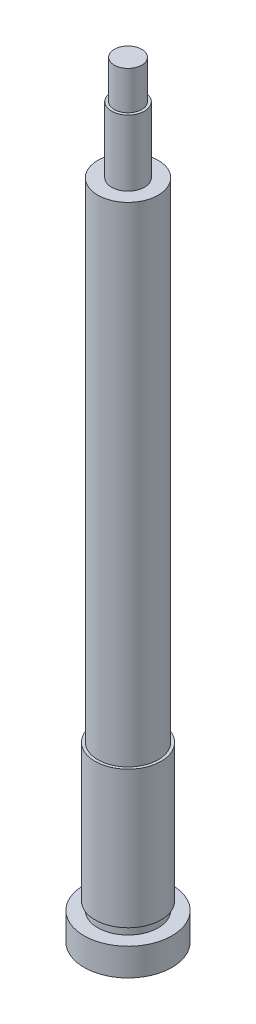
ISO-10303-21;
HEADER;
FILE_DESCRIPTION(('STEP AP214'),'2;1');
FILE_NAME('part.step','',(''),(''),'','','');
FILE_SCHEMA(('AUTOMOTIVE_DESIGN { 1 0 10303 214 1 1 1 1 }'));
ENDSEC;
DATA;
#1=APPLICATION_CONTEXT('core data for automotive mechanical design processes');
#2=APPLICATION_PROTOCOL_DEFINITION('international standard','automotive_design',2000,#1);
#3=PRODUCT_CONTEXT('',#1,'mechanical');
#4=PRODUCT('Part','Part','',(#3));
#5=PRODUCT_RELATED_PRODUCT_CATEGORY('part','',(#4));
#6=PRODUCT_DEFINITION_FORMATION('','',#4);
#7=PRODUCT_DEFINITION_CONTEXT('part definition',#1,'design');
#8=PRODUCT_DEFINITION('design','',#6,#7);
#9=PRODUCT_DEFINITION_SHAPE('','',#8);
#10=(LENGTH_UNIT() NAMED_UNIT(*) SI_UNIT(.MILLI.,.METRE.));
#11=(NAMED_UNIT(*) PLANE_ANGLE_UNIT() SI_UNIT($,.RADIAN.));
#12=(NAMED_UNIT(*) SI_UNIT($,.STERADIAN.) SOLID_ANGLE_UNIT());
#13=UNCERTAINTY_MEASURE_WITH_UNIT(LENGTH_MEASURE(1.E-05),#10,'distance_accuracy_value','');
#14=(GEOMETRIC_REPRESENTATION_CONTEXT(3) GLOBAL_UNCERTAINTY_ASSIGNED_CONTEXT((#13)) GLOBAL_UNIT_ASSIGNED_CONTEXT((#10,
#11,#12)) REPRESENTATION_CONTEXT('',''));
#15=CARTESIAN_POINT('',(0.,0.,0.));
#16=DIRECTION('',(0.,0.,1.));
#17=DIRECTION('',(1.,0.,0.));
#18=AXIS2_PLACEMENT_3D('',#15,#16,#17);
#19=CARTESIAN_POINT('',(0.,0.,0.));
#20=DIRECTION('',(0.,1.,0.));
#21=DIRECTION('',(0.,0.,1.));
#22=AXIS2_PLACEMENT_3D('',#19,#20,#21);
#23=PLANE('',#22);
#24=CARTESIAN_POINT('',(0.,0.,0.));
#25=DIRECTION('',(0.,-1.,0.));
#26=DIRECTION('',(0.,0.,-1.));
#27=AXIS2_PLACEMENT_3D('',#24,#25,#26);
#28=CIRCLE('',#27,16.);
#29=CARTESIAN_POINT('',(0.,0.,-16.));
#30=VERTEX_POINT('',#29);
#31=EDGE_CURVE('E10',#30,#30,#28,.T.);
#32=ORIENTED_EDGE('',*,*,#31,.T.);
#33=EDGE_LOOP('',(#32));
#34=FACE_BOUND('',#33,.T.);
#35=ADVANCED_FACE('F33',(#34),#23,.F.);
#36=CARTESIAN_POINT('',(0.,0.,0.));
#37=DIRECTION('',(0.,-1.,0.));
#38=DIRECTION('',(0.,0.,-1.));
#39=AXIS2_PLACEMENT_3D('',#36,#37,#38);
#40=CYLINDRICAL_SURFACE('',#39,16.);
#41=ORIENTED_EDGE('',*,*,#31,.F.);
#42=EDGE_LOOP('',(#41));
#43=FACE_BOUND('',#42,.T.);
#44=CARTESIAN_POINT('',(0.,10.,0.));
#45=DIRECTION('',(0.,-1.,0.));
#46=DIRECTION('',(0.,0.,-1.));
#47=AXIS2_PLACEMENT_3D('',#44,#45,#46);
#48=CIRCLE('',#47,16.);
#49=CARTESIAN_POINT('',(0.,10.,-16.));
#50=VERTEX_POINT('',#49);
#51=EDGE_CURVE('E39',#50,#50,#48,.T.);
#52=ORIENTED_EDGE('',*,*,#51,.T.);
#53=EDGE_LOOP('',(#52));
#54=FACE_BOUND('',#53,.T.);
#55=ADVANCED_FACE('F89',(#43,#54),#40,.T.);
#56=CARTESIAN_POINT('',(-11.,10.,0.));
#57=DIRECTION('',(0.,-1.,0.));
#58=DIRECTION('',(0.,0.,-1.));
#59=AXIS2_PLACEMENT_3D('',#56,#57,#58);
#60=PLANE('',#59);
#61=ORIENTED_EDGE('',*,*,#51,.F.);
#62=EDGE_LOOP('',(#61));
#63=FACE_BOUND('',#62,.T.);
#64=CARTESIAN_POINT('',(0.,10.,0.));
#65=DIRECTION('',(0.,-1.,0.));
#66=DIRECTION('',(0.,0.,-1.));
#67=AXIS2_PLACEMENT_3D('',#64,#65,#66);
#68=CIRCLE('',#67,11.);
#69=CARTESIAN_POINT('',(0.,10.,-11.));
#70=VERTEX_POINT('',#69);
#71=EDGE_CURVE('E43',#70,#70,#68,.T.);
#72=ORIENTED_EDGE('',*,*,#71,.T.);
#73=EDGE_LOOP('',(#72));
#74=FACE_BOUND('',#73,.T.);
#75=ADVANCED_FACE('F93',(#63,#74),#60,.F.);
#76=CARTESIAN_POINT('',(0.,0.,0.));
#77=DIRECTION('',(0.,-1.,0.));
#78=DIRECTION('',(0.,0.,-1.));
#79=AXIS2_PLACEMENT_3D('',#76,#77,#78);
#80=CYLINDRICAL_SURFACE('',#79,11.);
#81=ORIENTED_EDGE('',*,*,#71,.F.);
#82=EDGE_LOOP('',(#81));
#83=FACE_BOUND('',#82,.T.);
#84=CARTESIAN_POINT('',(0.,13.,0.));
#85=DIRECTION('',(0.,-1.,0.));
#86=DIRECTION('',(0.,0.,-1.));
#87=AXIS2_PLACEMENT_3D('',#84,#85,#86);
#88=CIRCLE('',#87,11.);
#89=CARTESIAN_POINT('',(0.,13.,-11.));
#90=VERTEX_POINT('',#89);
#91=EDGE_CURVE('E47',#90,#90,#88,.T.);
#92=ORIENTED_EDGE('',*,*,#91,.T.);
#93=EDGE_LOOP('',(#92));
#94=FACE_BOUND('',#93,.T.);
#95=ADVANCED_FACE('F98',(#83,#94),#80,.T.);
#96=CARTESIAN_POINT('',(-11.,13.,0.));
#97=DIRECTION('',(0.,1.,0.));
#98=DIRECTION('',(0.,0.,1.));
#99=AXIS2_PLACEMENT_3D('',#96,#97,#98);
#100=PLANE('',#99);
#101=ORIENTED_EDGE('',*,*,#91,.F.);
#102=EDGE_LOOP('',(#101));
#103=FACE_BOUND('',#102,.T.);
#104=CARTESIAN_POINT('',(0.,13.,0.));
#105=DIRECTION('',(0.,-1.,0.));
#106=DIRECTION('',(0.,0.,-1.));
#107=AXIS2_PLACEMENT_3D('',#104,#105,#106);
#108=CIRCLE('',#107,12.);
#109=CARTESIAN_POINT('',(0.,13.,-12.));
#110=VERTEX_POINT('',#109);
#111=EDGE_CURVE('E52',#110,#110,#108,.T.);
#112=ORIENTED_EDGE('',*,*,#111,.T.);
#113=EDGE_LOOP('',(#112));
#114=FACE_BOUND('',#113,.T.);
#115=ADVANCED_FACE('F104',(#103,#114),#100,.F.);
#116=CARTESIAN_POINT('',(0.,0.,0.));
#117=DIRECTION('',(0.,-1.,0.));
#118=DIRECTION('',(0.,0.,-1.));
#119=AXIS2_PLACEMENT_3D('',#116,#117,#118);
#120=CYLINDRICAL_SURFACE('',#119,12.);
#121=ORIENTED_EDGE('',*,*,#111,.F.);
#122=EDGE_LOOP('',(#121));
#123=FACE_BOUND('',#122,.T.);
#124=CARTESIAN_POINT('',(0.,63.,0.));
#125=DIRECTION('',(0.,-1.,0.));
#126=DIRECTION('',(0.,0.,-1.));
#127=AXIS2_PLACEMENT_3D('',#124,#125,#126);
#128=CIRCLE('',#127,12.);
#129=CARTESIAN_POINT('',(0.,63.,-12.));
#130=VERTEX_POINT('',#129);
#131=EDGE_CURVE('E55',#130,#130,#128,.T.);
#132=ORIENTED_EDGE('',*,*,#131,.T.);
#133=EDGE_LOOP('',(#132));
#134=FACE_BOUND('',#133,.T.);
#135=ADVANCED_FACE('F108',(#123,#134),#120,.T.);
#136=CARTESIAN_POINT('',(-11.,63.,0.));
#137=DIRECTION('',(0.,-1.,0.));
#138=DIRECTION('',(0.,0.,-1.));
#139=AXIS2_PLACEMENT_3D('',#136,#137,#138);
#140=PLANE('',#139);
#141=ORIENTED_EDGE('',*,*,#131,.F.);
#142=EDGE_LOOP('',(#141));
#143=FACE_BOUND('',#142,.T.);
#144=CARTESIAN_POINT('',(0.,63.,0.));
#145=DIRECTION('',(0.,-1.,0.));
#146=DIRECTION('',(0.,0.,-1.));
#147=AXIS2_PLACEMENT_3D('',#144,#145,#146);
#148=CIRCLE('',#147,11.);
#149=CARTESIAN_POINT('',(0.,63.,-11.));
#150=VERTEX_POINT('',#149);
#151=EDGE_CURVE('E58',#150,#150,#148,.T.);
#152=ORIENTED_EDGE('',*,*,#151,.T.);
#153=EDGE_LOOP('',(#152));
#154=FACE_BOUND('',#153,.T.);
#155=ADVANCED_FACE('F112',(#143,#154),#140,.F.);
#156=CARTESIAN_POINT('',(0.,0.,0.));
#157=DIRECTION('',(0.,-1.,0.));
#158=DIRECTION('',(0.,0.,-1.));
#159=AXIS2_PLACEMENT_3D('',#156,#157,#158);
#160=CYLINDRICAL_SURFACE('',#159,11.);
#161=ORIENTED_EDGE('',*,*,#151,.F.);
#162=EDGE_LOOP('',(#161));
#163=FACE_BOUND('',#162,.T.);
#164=CARTESIAN_POINT('',(0.,241.,0.));
#165=DIRECTION('',(0.,-1.,0.));
#166=DIRECTION('',(0.,0.,-1.));
#167=AXIS2_PLACEMENT_3D('',#164,#165,#166);
#168=CIRCLE('',#167,11.);
#169=CARTESIAN_POINT('',(0.,241.,-11.));
#170=VERTEX_POINT('',#169);
#171=EDGE_CURVE('E61',#170,#170,#168,.T.);
#172=ORIENTED_EDGE('',*,*,#171,.T.);
#173=EDGE_LOOP('',(#172));
#174=FACE_BOUND('',#173,.T.);
#175=ADVANCED_FACE('F116',(#163,#174),#160,.T.);
#176=CARTESIAN_POINT('',(-6.,241.,0.));
#177=DIRECTION('',(0.,-1.,0.));
#178=DIRECTION('',(0.,0.,-1.));
#179=AXIS2_PLACEMENT_3D('',#176,#177,#178);
#180=PLANE('',#179);
#181=ORIENTED_EDGE('',*,*,#171,.F.);
#182=EDGE_LOOP('',(#181));
#183=FACE_BOUND('',#182,.T.);
#184=CARTESIAN_POINT('',(0.,241.,0.));
#185=DIRECTION('',(0.,-1.,0.));
#186=DIRECTION('',(0.,0.,-1.));
#187=AXIS2_PLACEMENT_3D('',#184,#185,#186);
#188=CIRCLE('',#187,6.);
#189=CARTESIAN_POINT('',(0.,241.,-6.));
#190=VERTEX_POINT('',#189);
#191=EDGE_CURVE('E64',#190,#190,#188,.T.);
#192=ORIENTED_EDGE('',*,*,#191,.T.);
#193=EDGE_LOOP('',(#192));
#194=FACE_BOUND('',#193,.T.);
#195=ADVANCED_FACE('F120',(#183,#194),#180,.F.);
#196=CARTESIAN_POINT('',(0.,0.,0.));
#197=DIRECTION('',(0.,-1.,0.));
#198=DIRECTION('',(0.,0.,-1.));
#199=AXIS2_PLACEMENT_3D('',#196,#197,#198);
#200=CYLINDRICAL_SURFACE('',#199,6.);
#201=ORIENTED_EDGE('',*,*,#191,.F.);
#202=EDGE_LOOP('',(#201));
#203=FACE_BOUND('',#202,.T.);
#204=CARTESIAN_POINT('',(0.,265.,0.));
#205=DIRECTION('',(0.,-1.,0.));
#206=DIRECTION('',(0.,0.,-1.));
#207=AXIS2_PLACEMENT_3D('',#204,#205,#206);
#208=CIRCLE('',#207,6.);
#209=CARTESIAN_POINT('',(0.,265.,-6.));
#210=VERTEX_POINT('',#209);
#211=EDGE_CURVE('E67',#210,#210,#208,.T.);
#212=ORIENTED_EDGE('',*,*,#211,.T.);
#213=EDGE_LOOP('',(#212));
#214=FACE_BOUND('',#213,.T.);
#215=ADVANCED_FACE('F124',(#203,#214),#200,.T.);
#216=CARTESIAN_POINT('',(-5.,265.,0.));
#217=DIRECTION('',(0.,-1.,0.));
#218=DIRECTION('',(0.,0.,-1.));
#219=AXIS2_PLACEMENT_3D('',#216,#217,#218);
#220=PLANE('',#219);
#221=ORIENTED_EDGE('',*,*,#211,.F.);
#222=EDGE_LOOP('',(#221));
#223=FACE_BOUND('',#222,.T.);
#224=CARTESIAN_POINT('',(0.,265.,0.));
#225=DIRECTION('',(0.,-1.,0.));
#226=DIRECTION('',(0.,0.,-1.));
#227=AXIS2_PLACEMENT_3D('',#224,#225,#226);
#228=CIRCLE('',#227,5.);
#229=CARTESIAN_POINT('',(0.,265.,-5.));
#230=VERTEX_POINT('',#229);
#231=EDGE_CURVE('E70',#230,#230,#228,.T.);
#232=ORIENTED_EDGE('',*,*,#231,.T.);
#233=EDGE_LOOP('',(#232));
#234=FACE_BOUND('',#233,.T.);
#235=ADVANCED_FACE('F85',(#223,#234),#220,.F.);
#236=CARTESIAN_POINT('',(0.,0.,0.));
#237=DIRECTION('',(0.,-1.,0.));
#238=DIRECTION('',(0.,0.,-1.));
#239=AXIS2_PLACEMENT_3D('',#236,#237,#238);
#240=CYLINDRICAL_SURFACE('',#239,5.);
#241=ORIENTED_EDGE('',*,*,#231,.F.);
#242=EDGE_LOOP('',(#241));
#243=FACE_BOUND('',#242,.T.);
#244=CARTESIAN_POINT('',(0.,279.,0.));
#245=DIRECTION('',(0.,-1.,0.));
#246=DIRECTION('',(0.,0.,-1.));
#247=AXIS2_PLACEMENT_3D('',#244,#245,#246);
#248=CIRCLE('',#247,5.);
#249=CARTESIAN_POINT('',(0.,279.,-5.));
#250=VERTEX_POINT('',#249);
#251=EDGE_CURVE('E73',#250,#250,#248,.T.);
#252=ORIENTED_EDGE('',*,*,#251,.T.);
#253=EDGE_LOOP('',(#252));
#254=FACE_BOUND('',#253,.T.);
#255=ADVANCED_FACE('F77',(#243,#254),#240,.T.);
#256=CARTESIAN_POINT('',(-5.,279.,0.));
#257=DIRECTION('',(0.,-1.,0.));
#258=DIRECTION('',(0.,0.,-1.));
#259=AXIS2_PLACEMENT_3D('',#256,#257,#258);
#260=PLANE('',#259);
#261=ORIENTED_EDGE('',*,*,#251,.F.);
#262=EDGE_LOOP('',(#261));
#263=FACE_BOUND('',#262,.T.);
#264=ADVANCED_FACE('F79',(#263),#260,.F.);
#265=CLOSED_SHELL('',(#35,#55,#75,#95,#115,#135,#155,#175,#195,#215,#235,#255,#264));
#266=MANIFOLD_SOLID_BREP('B2',#265);
#267=ADVANCED_BREP_SHAPE_REPRESENTATION('',(#18,#266),#14);
#268=SHAPE_DEFINITION_REPRESENTATION(#9,#267);
ENDSEC;
END-ISO-10303-21;
